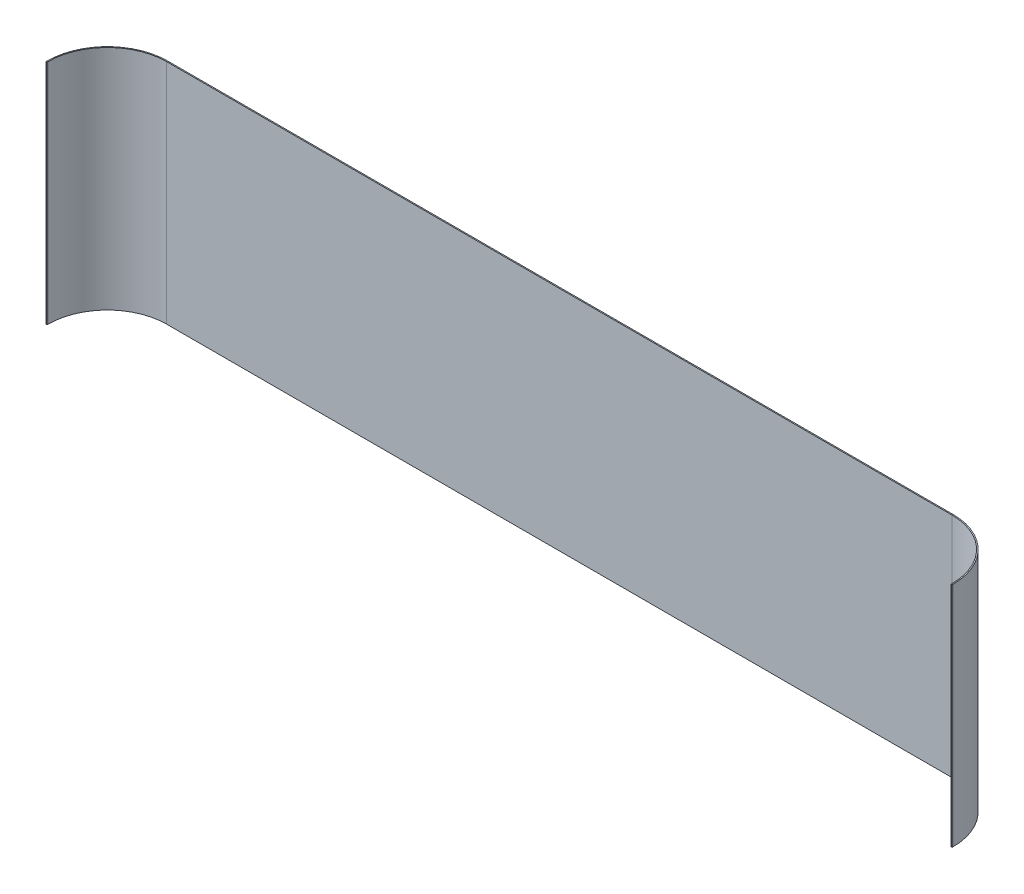
ISO-10303-21;
HEADER;
FILE_DESCRIPTION(('STEP AP214'),'2;1');
FILE_NAME('part.step','',(''),(''),'','','');
FILE_SCHEMA(('AUTOMOTIVE_DESIGN { 1 0 10303 214 1 1 1 1 }'));
ENDSEC;
DATA;
#1=APPLICATION_CONTEXT('core data for automotive mechanical design processes');
#2=APPLICATION_PROTOCOL_DEFINITION('international standard','automotive_design',2000,#1);
#3=PRODUCT_CONTEXT('',#1,'mechanical');
#4=PRODUCT('Part','Part','',(#3));
#5=PRODUCT_RELATED_PRODUCT_CATEGORY('part','',(#4));
#6=PRODUCT_DEFINITION_FORMATION('','',#4);
#7=PRODUCT_DEFINITION_CONTEXT('part definition',#1,'design');
#8=PRODUCT_DEFINITION('design','',#6,#7);
#9=PRODUCT_DEFINITION_SHAPE('','',#8);
#10=(LENGTH_UNIT() NAMED_UNIT(*) SI_UNIT(.MILLI.,.METRE.));
#11=(NAMED_UNIT(*) PLANE_ANGLE_UNIT() SI_UNIT($,.RADIAN.));
#12=(NAMED_UNIT(*) SI_UNIT($,.STERADIAN.) SOLID_ANGLE_UNIT());
#13=UNCERTAINTY_MEASURE_WITH_UNIT(LENGTH_MEASURE(1.E-05),#10,'distance_accuracy_value','');
#14=(GEOMETRIC_REPRESENTATION_CONTEXT(3) GLOBAL_UNCERTAINTY_ASSIGNED_CONTEXT((#13)) GLOBAL_UNIT_ASSIGNED_CONTEXT((#10,
#11,#12)) REPRESENTATION_CONTEXT('',''));
#15=CARTESIAN_POINT('',(0.,0.,0.));
#16=DIRECTION('',(0.,0.,1.));
#17=DIRECTION('',(1.,0.,0.));
#18=AXIS2_PLACEMENT_3D('',#15,#16,#17);
#19=CARTESIAN_POINT('',(-495.,249.,32.0000000000005));
#20=DIRECTION('',(0.,1.,0.));
#21=DIRECTION('',(0.,0.,1.));
#22=AXIS2_PLACEMENT_3D('',#19,#20,#21);
#23=PLANE('',#22);
#24=DIRECTION('',(-1.,0.,0.));
#25=VECTOR('',#24,1.);
#26=CARTESIAN_POINT('',(-495.,249.,32.0000000000005));
#27=LINE('',#26,#25);
#28=CARTESIAN_POINT('',(-495.,249.,32.0000000000005));
#29=VERTEX_POINT('',#28);
#30=CARTESIAN_POINT('',(-496.2,249.,32.0000000000005));
#31=VERTEX_POINT('',#30);
#32=EDGE_CURVE('E11',#29,#31,#27,.T.);
#33=ORIENTED_EDGE('',*,*,#32,.F.);
#34=CARTESIAN_POINT('',(-430.,249.,32.));
#35=DIRECTION('',(0.,1.,0.));
#36=DIRECTION('',(0.,0.,-1.));
#37=AXIS2_PLACEMENT_3D('',#34,#35,#36);
#38=CIRCLE('',#37,65.);
#39=CARTESIAN_POINT('',(-430.,249.,-33.));
#40=VERTEX_POINT('',#39);
#41=EDGE_CURVE('E240',#40,#29,#38,.T.);
#42=ORIENTED_EDGE('',*,*,#41,.F.);
#43=DIRECTION('',(0.,0.,1.));
#44=VECTOR('',#43,1.);
#45=CARTESIAN_POINT('',(-430.,249.,-34.2));
#46=LINE('',#45,#44);
#47=CARTESIAN_POINT('',(-430.,249.,-34.2));
#48=VERTEX_POINT('',#47);
#49=EDGE_CURVE('E43',#48,#40,#46,.T.);
#50=ORIENTED_EDGE('',*,*,#49,.F.);
#51=CARTESIAN_POINT('',(-430.,249.,32.));
#52=DIRECTION('',(0.,1.,0.));
#53=DIRECTION('',(1.,0.,0.));
#54=AXIS2_PLACEMENT_3D('',#51,#52,#53);
#55=CIRCLE('',#54,66.2);
#56=EDGE_CURVE('E167',#48,#31,#55,.T.);
#57=ORIENTED_EDGE('',*,*,#56,.T.);
#58=EDGE_LOOP('',(#33,#42,#50,#57));
#59=FACE_BOUND('',#58,.T.);
#60=ADVANCED_FACE('F35',(#59),#23,.T.);
#61=CARTESIAN_POINT('',(-430.,249.,-34.2));
#62=DIRECTION('',(0.,1.,0.));
#63=DIRECTION('',(0.,0.,1.));
#64=AXIS2_PLACEMENT_3D('',#61,#62,#63);
#65=PLANE('',#64);
#66=DIRECTION('',(0.,0.,1.));
#67=VECTOR('',#66,1.);
#68=CARTESIAN_POINT('',(-495.,249.,33.));
#69=LINE('',#68,#67);
#70=CARTESIAN_POINT('',(-495.,249.,33.));
#71=VERTEX_POINT('',#70);
#72=EDGE_CURVE('E244',#29,#71,#69,.T.);
#73=ORIENTED_EDGE('',*,*,#72,.F.);
#74=ORIENTED_EDGE('',*,*,#32,.T.);
#75=DIRECTION('',(0.,0.,-1.));
#76=VECTOR('',#75,1.);
#77=CARTESIAN_POINT('',(-496.2,249.,33.));
#78=LINE('',#77,#76);
#79=CARTESIAN_POINT('',(-496.2,249.,33.));
#80=VERTEX_POINT('',#79);
#81=EDGE_CURVE('E103',#31,#80,#78,.F.);
#82=ORIENTED_EDGE('',*,*,#81,.T.);
#83=DIRECTION('',(-1.,0.,0.));
#84=VECTOR('',#83,1.);
#85=CARTESIAN_POINT('',(-495.,249.,33.));
#86=LINE('',#85,#84);
#87=EDGE_CURVE('E515',#71,#80,#86,.T.);
#88=ORIENTED_EDGE('',*,*,#87,.F.);
#89=EDGE_LOOP('',(#73,#74,#82,#88));
#90=FACE_BOUND('',#89,.T.);
#91=ADVANCED_FACE('F293',(#90),#65,.T.);
#92=CARTESIAN_POINT('',(-430.,0.,-33.));
#93=DIRECTION('',(0.,-1.,0.));
#94=DIRECTION('',(0.,0.,-1.));
#95=AXIS2_PLACEMENT_3D('',#92,#93,#94);
#96=PLANE('',#95);
#97=DIRECTION('',(0.,0.,-1.));
#98=VECTOR('',#97,1.);
#99=CARTESIAN_POINT('',(-430.,0.,-33.));
#100=LINE('',#99,#98);
#101=CARTESIAN_POINT('',(-430.,0.,-33.));
#102=VERTEX_POINT('',#101);
#103=CARTESIAN_POINT('',(-430.,0.,-34.2));
#104=VERTEX_POINT('',#103);
#105=EDGE_CURVE('E90',#102,#104,#100,.T.);
#106=ORIENTED_EDGE('',*,*,#105,.F.);
#107=CARTESIAN_POINT('',(-430.,0.,32.));
#108=DIRECTION('',(0.,1.,0.));
#109=DIRECTION('',(0.,0.,-1.));
#110=AXIS2_PLACEMENT_3D('',#107,#108,#109);
#111=CIRCLE('',#110,65.);
#112=CARTESIAN_POINT('',(-495.,0.,32.0000000000005));
#113=VERTEX_POINT('',#112);
#114=EDGE_CURVE('E182',#102,#113,#111,.T.);
#115=ORIENTED_EDGE('',*,*,#114,.T.);
#116=DIRECTION('',(1.,0.,0.));
#117=VECTOR('',#116,1.);
#118=CARTESIAN_POINT('',(-496.2,0.,32.0000000000005));
#119=LINE('',#118,#117);
#120=CARTESIAN_POINT('',(-496.2,0.,32.0000000000005));
#121=VERTEX_POINT('',#120);
#122=EDGE_CURVE('E97',#121,#113,#119,.T.);
#123=ORIENTED_EDGE('',*,*,#122,.F.);
#124=CARTESIAN_POINT('',(-430.,0.,32.));
#125=DIRECTION('',(0.,1.,0.));
#126=DIRECTION('',(1.,0.,0.));
#127=AXIS2_PLACEMENT_3D('',#124,#125,#126);
#128=CIRCLE('',#127,66.2);
#129=EDGE_CURVE('E201',#104,#121,#128,.T.);
#130=ORIENTED_EDGE('',*,*,#129,.F.);
#131=EDGE_LOOP('',(#106,#115,#123,#130));
#132=FACE_BOUND('',#131,.T.);
#133=ADVANCED_FACE('F297',(#132),#96,.T.);
#134=CARTESIAN_POINT('',(-496.2,0.,32.0000000000005));
#135=DIRECTION('',(0.,-1.,0.));
#136=DIRECTION('',(0.,0.,-1.));
#137=AXIS2_PLACEMENT_3D('',#134,#135,#136);
#138=PLANE('',#137);
#139=DIRECTION('',(-1.,0.,0.));
#140=VECTOR('',#139,1.);
#141=CARTESIAN_POINT('',(-430.,0.,-33.));
#142=LINE('',#141,#140);
#143=CARTESIAN_POINT('',(429.999999999999,0.,-33.));
#144=VERTEX_POINT('',#143);
#145=EDGE_CURVE('E184',#144,#102,#142,.T.);
#146=ORIENTED_EDGE('',*,*,#145,.T.);
#147=ORIENTED_EDGE('',*,*,#105,.T.);
#148=DIRECTION('',(1.,0.,0.));
#149=VECTOR('',#148,1.);
#150=CARTESIAN_POINT('',(-430.,0.,-34.2));
#151=LINE('',#150,#149);
#152=CARTESIAN_POINT('',(429.999999999999,0.,-34.2));
#153=VERTEX_POINT('',#152);
#154=EDGE_CURVE('E199',#153,#104,#151,.F.);
#155=ORIENTED_EDGE('',*,*,#154,.F.);
#156=DIRECTION('',(0.,0.,1.));
#157=VECTOR('',#156,1.);
#158=CARTESIAN_POINT('',(429.999999999999,0.,-34.2));
#159=LINE('',#158,#157);
#160=EDGE_CURVE('E227',#153,#144,#159,.T.);
#161=ORIENTED_EDGE('',*,*,#160,.T.);
#162=EDGE_LOOP('',(#146,#147,#155,#161));
#163=FACE_BOUND('',#162,.T.);
#164=ADVANCED_FACE('F270',(#163),#138,.T.);
#165=CARTESIAN_POINT('',(429.999999999999,249.,-33.));
#166=DIRECTION('',(0.,1.,0.));
#167=DIRECTION('',(0.,0.,1.));
#168=AXIS2_PLACEMENT_3D('',#165,#166,#167);
#169=PLANE('',#168);
#170=DIRECTION('',(0.,0.,-1.));
#171=VECTOR('',#170,1.);
#172=CARTESIAN_POINT('',(429.999999999999,249.,-33.));
#173=LINE('',#172,#171);
#174=CARTESIAN_POINT('',(429.999999999999,249.,-33.));
#175=VERTEX_POINT('',#174);
#176=CARTESIAN_POINT('',(429.999999999999,249.,-34.2));
#177=VERTEX_POINT('',#176);
#178=EDGE_CURVE('E131',#175,#177,#173,.T.);
#179=ORIENTED_EDGE('',*,*,#178,.F.);
#180=CARTESIAN_POINT('',(430.,249.,32.));
#181=DIRECTION('',(0.,1.,0.));
#182=DIRECTION('',(0.,0.,-1.));
#183=AXIS2_PLACEMENT_3D('',#180,#181,#182);
#184=CIRCLE('',#183,65.);
#185=CARTESIAN_POINT('',(495.,249.,32.0000000000005));
#186=VERTEX_POINT('',#185);
#187=EDGE_CURVE('E247',#186,#175,#184,.T.);
#188=ORIENTED_EDGE('',*,*,#187,.F.);
#189=DIRECTION('',(-1.,0.,0.));
#190=VECTOR('',#189,1.);
#191=CARTESIAN_POINT('',(496.2,249.,32.0000000000005));
#192=LINE('',#191,#190);
#193=CARTESIAN_POINT('',(496.2,249.,32.0000000000005));
#194=VERTEX_POINT('',#193);
#195=EDGE_CURVE('E143',#194,#186,#192,.T.);
#196=ORIENTED_EDGE('',*,*,#195,.F.);
#197=CARTESIAN_POINT('',(430.,249.,32.));
#198=DIRECTION('',(0.,1.,0.));
#199=DIRECTION('',(1.,0.,0.));
#200=AXIS2_PLACEMENT_3D('',#197,#198,#199);
#201=CIRCLE('',#200,66.2);
#202=EDGE_CURVE('E146',#194,#177,#201,.T.);
#203=ORIENTED_EDGE('',*,*,#202,.T.);
#204=EDGE_LOOP('',(#179,#188,#196,#203));
#205=FACE_BOUND('',#204,.T.);
#206=ADVANCED_FACE('F148',(#205),#169,.T.);
#207=CARTESIAN_POINT('',(496.2,249.,32.0000000000005));
#208=DIRECTION('',(0.,1.,0.));
#209=DIRECTION('',(0.,0.,1.));
#210=AXIS2_PLACEMENT_3D('',#207,#208,#209);
#211=PLANE('',#210);
#212=DIRECTION('',(-1.,0.,0.));
#213=VECTOR('',#212,1.);
#214=CARTESIAN_POINT('',(-430.,249.,-33.));
#215=LINE('',#214,#213);
#216=EDGE_CURVE('E138',#175,#40,#215,.T.);
#217=ORIENTED_EDGE('',*,*,#216,.F.);
#218=ORIENTED_EDGE('',*,*,#178,.T.);
#219=DIRECTION('',(1.,0.,0.));
#220=VECTOR('',#219,1.);
#221=CARTESIAN_POINT('',(-430.,249.,-34.2));
#222=LINE('',#221,#220);
#223=EDGE_CURVE('E135',#177,#48,#222,.F.);
#224=ORIENTED_EDGE('',*,*,#223,.T.);
#225=ORIENTED_EDGE('',*,*,#49,.T.);
#226=EDGE_LOOP('',(#217,#218,#224,#225));
#227=FACE_BOUND('',#226,.T.);
#228=ADVANCED_FACE('F133',(#227),#211,.T.);
#229=CARTESIAN_POINT('',(495.,0.,32.0000000000005));
#230=DIRECTION('',(0.,-1.,0.));
#231=DIRECTION('',(0.,0.,-1.));
#232=AXIS2_PLACEMENT_3D('',#229,#230,#231);
#233=PLANE('',#232);
#234=DIRECTION('',(1.,0.,0.));
#235=VECTOR('',#234,1.);
#236=CARTESIAN_POINT('',(495.,0.,32.0000000000005));
#237=LINE('',#236,#235);
#238=CARTESIAN_POINT('',(495.,0.,32.0000000000005));
#239=VERTEX_POINT('',#238);
#240=CARTESIAN_POINT('',(496.2,0.,32.0000000000005));
#241=VERTEX_POINT('',#240);
#242=EDGE_CURVE('E229',#239,#241,#237,.T.);
#243=ORIENTED_EDGE('',*,*,#242,.F.);
#244=CARTESIAN_POINT('',(430.,0.,32.));
#245=DIRECTION('',(0.,1.,0.));
#246=DIRECTION('',(0.,0.,-1.));
#247=AXIS2_PLACEMENT_3D('',#244,#245,#246);
#248=CIRCLE('',#247,65.);
#249=EDGE_CURVE('E186',#239,#144,#248,.T.);
#250=ORIENTED_EDGE('',*,*,#249,.T.);
#251=ORIENTED_EDGE('',*,*,#160,.F.);
#252=CARTESIAN_POINT('',(430.,0.,32.));
#253=DIRECTION('',(0.,1.,0.));
#254=DIRECTION('',(1.,0.,0.));
#255=AXIS2_PLACEMENT_3D('',#252,#253,#254);
#256=CIRCLE('',#255,66.2);
#257=EDGE_CURVE('E159',#241,#153,#256,.T.);
#258=ORIENTED_EDGE('',*,*,#257,.F.);
#259=EDGE_LOOP('',(#243,#250,#251,#258));
#260=FACE_BOUND('',#259,.T.);
#261=ADVANCED_FACE('F268',(#260),#233,.T.);
#262=CARTESIAN_POINT('',(429.999999999999,0.,-34.2));
#263=DIRECTION('',(0.,-1.,0.));
#264=DIRECTION('',(0.,0.,-1.));
#265=AXIS2_PLACEMENT_3D('',#262,#263,#264);
#266=PLANE('',#265);
#267=DIRECTION('',(0.,0.,-1.));
#268=VECTOR('',#267,1.);
#269=CARTESIAN_POINT('',(495.,0.,33.));
#270=LINE('',#269,#268);
#271=CARTESIAN_POINT('',(495.,0.,33.));
#272=VERTEX_POINT('',#271);
#273=EDGE_CURVE('E189',#272,#239,#270,.T.);
#274=ORIENTED_EDGE('',*,*,#273,.T.);
#275=ORIENTED_EDGE('',*,*,#242,.T.);
#276=DIRECTION('',(0.,0.,-1.));
#277=VECTOR('',#276,1.);
#278=CARTESIAN_POINT('',(496.2,0.,33.));
#279=LINE('',#278,#277);
#280=CARTESIAN_POINT('',(496.2,0.,33.));
#281=VERTEX_POINT('',#280);
#282=EDGE_CURVE('E195',#281,#241,#279,.T.);
#283=ORIENTED_EDGE('',*,*,#282,.F.);
#284=DIRECTION('',(-1.,0.,0.));
#285=VECTOR('',#284,1.);
#286=CARTESIAN_POINT('',(496.2,0.,33.));
#287=LINE('',#286,#285);
#288=EDGE_CURVE('E192',#281,#272,#287,.T.);
#289=ORIENTED_EDGE('',*,*,#288,.T.);
#290=EDGE_LOOP('',(#274,#275,#283,#289));
#291=FACE_BOUND('',#290,.T.);
#292=ADVANCED_FACE('F280',(#291),#266,.T.);
#293=CARTESIAN_POINT('',(-496.2,249.,33.));
#294=DIRECTION('',(1.,0.,0.));
#295=DIRECTION('',(0.,0.,-1.));
#296=AXIS2_PLACEMENT_3D('',#293,#294,#295);
#297=PLANE('',#296);
#298=DIRECTION('',(0.,0.,-1.));
#299=VECTOR('',#298,1.);
#300=CARTESIAN_POINT('',(-496.2,0.,33.));
#301=LINE('',#300,#299);
#302=CARTESIAN_POINT('',(-496.2,0.,33.));
#303=VERTEX_POINT('',#302);
#304=EDGE_CURVE('E173',#121,#303,#301,.F.);
#305=ORIENTED_EDGE('',*,*,#304,.T.);
#306=DIRECTION('',(0.,-1.,0.));
#307=VECTOR('',#306,1.);
#308=CARTESIAN_POINT('',(-496.2,249.,33.));
#309=LINE('',#308,#307);
#310=EDGE_CURVE('E225',#80,#303,#309,.T.);
#311=ORIENTED_EDGE('',*,*,#310,.F.);
#312=ORIENTED_EDGE('',*,*,#81,.F.);
#313=DIRECTION('',(0.,-1.,0.));
#314=VECTOR('',#313,1.);
#315=CARTESIAN_POINT('',(-496.2,249.,32.0000000000005));
#316=LINE('',#315,#314);
#317=EDGE_CURVE('E169',#31,#121,#316,.T.);
#318=ORIENTED_EDGE('',*,*,#317,.T.);
#319=EDGE_LOOP('',(#305,#311,#312,#318));
#320=FACE_BOUND('',#319,.T.);
#321=ADVANCED_FACE('F282',(#320),#297,.F.);
#322=CARTESIAN_POINT('',(-495.,249.,33.));
#323=DIRECTION('',(0.,0.,1.));
#324=DIRECTION('',(1.,0.,0.));
#325=AXIS2_PLACEMENT_3D('',#322,#323,#324);
#326=PLANE('',#325);
#327=DIRECTION('',(-1.,0.,0.));
#328=VECTOR('',#327,1.);
#329=CARTESIAN_POINT('',(-495.,0.,33.));
#330=LINE('',#329,#328);
#331=CARTESIAN_POINT('',(-495.,0.,33.));
#332=VERTEX_POINT('',#331);
#333=EDGE_CURVE('E176',#332,#303,#330,.T.);
#334=ORIENTED_EDGE('',*,*,#333,.F.);
#335=DIRECTION('',(0.,-1.,0.));
#336=VECTOR('',#335,1.);
#337=CARTESIAN_POINT('',(-495.,249.,33.));
#338=LINE('',#337,#336);
#339=EDGE_CURVE('E223',#71,#332,#338,.T.);
#340=ORIENTED_EDGE('',*,*,#339,.F.);
#341=ORIENTED_EDGE('',*,*,#87,.T.);
#342=ORIENTED_EDGE('',*,*,#310,.T.);
#343=EDGE_LOOP('',(#334,#340,#341,#342));
#344=FACE_BOUND('',#343,.T.);
#345=ADVANCED_FACE('F288',(#344),#326,.T.);
#346=CARTESIAN_POINT('',(-495.,249.,33.));
#347=DIRECTION('',(1.,0.,0.));
#348=DIRECTION('',(0.,0.,-1.));
#349=AXIS2_PLACEMENT_3D('',#346,#347,#348);
#350=PLANE('',#349);
#351=DIRECTION('',(0.,0.,1.));
#352=VECTOR('',#351,1.);
#353=CARTESIAN_POINT('',(-495.,0.,33.));
#354=LINE('',#353,#352);
#355=EDGE_CURVE('E179',#113,#332,#354,.T.);
#356=ORIENTED_EDGE('',*,*,#355,.F.);
#357=DIRECTION('',(0.,-1.,0.));
#358=VECTOR('',#357,1.);
#359=CARTESIAN_POINT('',(-495.,249.,32.0000000000005));
#360=LINE('',#359,#358);
#361=EDGE_CURVE('E220',#29,#113,#360,.T.);
#362=ORIENTED_EDGE('',*,*,#361,.F.);
#363=ORIENTED_EDGE('',*,*,#72,.T.);
#364=ORIENTED_EDGE('',*,*,#339,.T.);
#365=EDGE_LOOP('',(#356,#362,#363,#364));
#366=FACE_BOUND('',#365,.T.);
#367=ADVANCED_FACE('F338',(#366),#350,.T.);
#368=CARTESIAN_POINT('',(-430.,249.,32.));
#369=DIRECTION('',(0.,-1.,0.));
#370=DIRECTION('',(0.,0.,-1.));
#371=AXIS2_PLACEMENT_3D('',#368,#369,#370);
#372=CYLINDRICAL_SURFACE('',#371,65.);
#373=ORIENTED_EDGE('',*,*,#114,.F.);
#374=DIRECTION('',(0.,-1.,0.));
#375=VECTOR('',#374,1.);
#376=CARTESIAN_POINT('',(-430.,249.,-33.));
#377=LINE('',#376,#375);
#378=EDGE_CURVE('E217',#40,#102,#377,.T.);
#379=ORIENTED_EDGE('',*,*,#378,.F.);
#380=ORIENTED_EDGE('',*,*,#41,.T.);
#381=ORIENTED_EDGE('',*,*,#361,.T.);
#382=EDGE_LOOP('',(#373,#379,#380,#381));
#383=FACE_BOUND('',#382,.T.);
#384=ADVANCED_FACE('F239',(#383),#372,.F.);
#385=CARTESIAN_POINT('',(-430.,249.,-33.));
#386=DIRECTION('',(0.,0.,1.));
#387=DIRECTION('',(1.,0.,0.));
#388=AXIS2_PLACEMENT_3D('',#385,#386,#387);
#389=PLANE('',#388);
#390=ORIENTED_EDGE('',*,*,#145,.F.);
#391=DIRECTION('',(0.,-1.,0.));
#392=VECTOR('',#391,1.);
#393=CARTESIAN_POINT('',(429.999999999999,249.,-33.));
#394=LINE('',#393,#392);
#395=EDGE_CURVE('E214',#175,#144,#394,.T.);
#396=ORIENTED_EDGE('',*,*,#395,.F.);
#397=ORIENTED_EDGE('',*,*,#216,.T.);
#398=ORIENTED_EDGE('',*,*,#378,.T.);
#399=EDGE_LOOP('',(#390,#396,#397,#398));
#400=FACE_BOUND('',#399,.T.);
#401=ADVANCED_FACE('F246',(#400),#389,.T.);
#402=CARTESIAN_POINT('',(430.,249.,32.));
#403=DIRECTION('',(0.,-1.,0.));
#404=DIRECTION('',(0.,0.,-1.));
#405=AXIS2_PLACEMENT_3D('',#402,#403,#404);
#406=CYLINDRICAL_SURFACE('',#405,65.);
#407=ORIENTED_EDGE('',*,*,#249,.F.);
#408=DIRECTION('',(0.,-1.,0.));
#409=VECTOR('',#408,1.);
#410=CARTESIAN_POINT('',(495.,249.,32.0000000000005));
#411=LINE('',#410,#409);
#412=EDGE_CURVE('E211',#186,#239,#411,.T.);
#413=ORIENTED_EDGE('',*,*,#412,.F.);
#414=ORIENTED_EDGE('',*,*,#187,.T.);
#415=ORIENTED_EDGE('',*,*,#395,.T.);
#416=EDGE_LOOP('',(#407,#413,#414,#415));
#417=FACE_BOUND('',#416,.T.);
#418=ADVANCED_FACE('F272',(#417),#406,.F.);
#419=CARTESIAN_POINT('',(495.,249.,33.));
#420=DIRECTION('',(-1.,0.,0.));
#421=DIRECTION('',(0.,0.,1.));
#422=AXIS2_PLACEMENT_3D('',#419,#420,#421);
#423=PLANE('',#422);
#424=ORIENTED_EDGE('',*,*,#273,.F.);
#425=DIRECTION('',(0.,-1.,0.));
#426=VECTOR('',#425,1.);
#427=CARTESIAN_POINT('',(495.,249.,33.));
#428=LINE('',#427,#426);
#429=CARTESIAN_POINT('',(495.,249.,33.));
#430=VERTEX_POINT('',#429);
#431=EDGE_CURVE('E209',#430,#272,#428,.T.);
#432=ORIENTED_EDGE('',*,*,#431,.F.);
#433=DIRECTION('',(0.,0.,-1.));
#434=VECTOR('',#433,1.);
#435=CARTESIAN_POINT('',(495.,249.,33.));
#436=LINE('',#435,#434);
#437=EDGE_CURVE('E249',#430,#186,#436,.T.);
#438=ORIENTED_EDGE('',*,*,#437,.T.);
#439=ORIENTED_EDGE('',*,*,#412,.T.);
#440=EDGE_LOOP('',(#424,#432,#438,#439));
#441=FACE_BOUND('',#440,.T.);
#442=ADVANCED_FACE('F275',(#441),#423,.T.);
#443=CARTESIAN_POINT('',(496.2,249.,33.));
#444=DIRECTION('',(0.,0.,1.));
#445=DIRECTION('',(1.,0.,0.));
#446=AXIS2_PLACEMENT_3D('',#443,#444,#445);
#447=PLANE('',#446);
#448=ORIENTED_EDGE('',*,*,#288,.F.);
#449=DIRECTION('',(0.,-1.,0.));
#450=VECTOR('',#449,1.);
#451=CARTESIAN_POINT('',(496.2,249.,33.));
#452=LINE('',#451,#450);
#453=CARTESIAN_POINT('',(496.2,249.,33.));
#454=VERTEX_POINT('',#453);
#455=EDGE_CURVE('E207',#454,#281,#452,.T.);
#456=ORIENTED_EDGE('',*,*,#455,.F.);
#457=DIRECTION('',(-1.,0.,0.));
#458=VECTOR('',#457,1.);
#459=CARTESIAN_POINT('',(496.2,249.,33.));
#460=LINE('',#459,#458);
#461=EDGE_CURVE('E255',#454,#430,#460,.T.);
#462=ORIENTED_EDGE('',*,*,#461,.T.);
#463=ORIENTED_EDGE('',*,*,#431,.T.);
#464=EDGE_LOOP('',(#448,#456,#462,#463));
#465=FACE_BOUND('',#464,.T.);
#466=ADVANCED_FACE('F278',(#465),#447,.T.);
#467=CARTESIAN_POINT('',(496.2,249.,33.));
#468=DIRECTION('',(-1.,0.,0.));
#469=DIRECTION('',(0.,0.,1.));
#470=AXIS2_PLACEMENT_3D('',#467,#468,#469);
#471=PLANE('',#470);
#472=ORIENTED_EDGE('',*,*,#282,.T.);
#473=DIRECTION('',(0.,-1.,0.));
#474=VECTOR('',#473,1.);
#475=CARTESIAN_POINT('',(496.2,249.,32.0000000000005));
#476=LINE('',#475,#474);
#477=EDGE_CURVE('E161',#194,#241,#476,.T.);
#478=ORIENTED_EDGE('',*,*,#477,.F.);
#479=DIRECTION('',(0.,0.,-1.));
#480=VECTOR('',#479,1.);
#481=CARTESIAN_POINT('',(496.2,249.,33.));
#482=LINE('',#481,#480);
#483=EDGE_CURVE('E152',#454,#194,#482,.T.);
#484=ORIENTED_EDGE('',*,*,#483,.F.);
#485=ORIENTED_EDGE('',*,*,#455,.T.);
#486=EDGE_LOOP('',(#472,#478,#484,#485));
#487=FACE_BOUND('',#486,.T.);
#488=ADVANCED_FACE('F265',(#487),#471,.F.);
#489=CARTESIAN_POINT('',(430.,249.,32.));
#490=DIRECTION('',(0.,-1.,0.));
#491=DIRECTION('',(0.,0.,-1.));
#492=AXIS2_PLACEMENT_3D('',#489,#490,#491);
#493=CYLINDRICAL_SURFACE('',#492,66.2);
#494=ORIENTED_EDGE('',*,*,#257,.T.);
#495=DIRECTION('',(0.,-1.,0.));
#496=VECTOR('',#495,1.);
#497=CARTESIAN_POINT('',(429.999999999999,249.,-34.2));
#498=LINE('',#497,#496);
#499=EDGE_CURVE('E156',#177,#153,#498,.T.);
#500=ORIENTED_EDGE('',*,*,#499,.F.);
#501=ORIENTED_EDGE('',*,*,#202,.F.);
#502=ORIENTED_EDGE('',*,*,#477,.T.);
#503=EDGE_LOOP('',(#494,#500,#501,#502));
#504=FACE_BOUND('',#503,.T.);
#505=ADVANCED_FACE('F157',(#504),#493,.T.);
#506=CARTESIAN_POINT('',(-430.,249.,-34.2));
#507=DIRECTION('',(0.,0.,1.));
#508=DIRECTION('',(1.,0.,0.));
#509=AXIS2_PLACEMENT_3D('',#506,#507,#508);
#510=PLANE('',#509);
#511=ORIENTED_EDGE('',*,*,#154,.T.);
#512=DIRECTION('',(0.,-1.,0.));
#513=VECTOR('',#512,1.);
#514=CARTESIAN_POINT('',(-430.,249.,-34.2));
#515=LINE('',#514,#513);
#516=EDGE_CURVE('E162',#48,#104,#515,.T.);
#517=ORIENTED_EDGE('',*,*,#516,.F.);
#518=ORIENTED_EDGE('',*,*,#223,.F.);
#519=ORIENTED_EDGE('',*,*,#499,.T.);
#520=EDGE_LOOP('',(#511,#517,#518,#519));
#521=FACE_BOUND('',#520,.T.);
#522=ADVANCED_FACE('F164',(#521),#510,.F.);
#523=CARTESIAN_POINT('',(-430.,249.,32.));
#524=DIRECTION('',(0.,-1.,0.));
#525=DIRECTION('',(0.,0.,-1.));
#526=AXIS2_PLACEMENT_3D('',#523,#524,#525);
#527=CYLINDRICAL_SURFACE('',#526,66.2);
#528=ORIENTED_EDGE('',*,*,#129,.T.);
#529=ORIENTED_EDGE('',*,*,#317,.F.);
#530=ORIENTED_EDGE('',*,*,#56,.F.);
#531=ORIENTED_EDGE('',*,*,#516,.T.);
#532=EDGE_LOOP('',(#528,#529,#530,#531));
#533=FACE_BOUND('',#532,.T.);
#534=ADVANCED_FACE('F422',(#533),#527,.T.);
#535=CARTESIAN_POINT('',(-430.,249.,32.));
#536=DIRECTION('',(0.,1.,0.));
#537=DIRECTION('',(1.,0.,0.));
#538=AXIS2_PLACEMENT_3D('',#535,#536,#537);
#539=PLANE('',#538);
#540=ORIENTED_EDGE('',*,*,#483,.T.);
#541=ORIENTED_EDGE('',*,*,#195,.T.);
#542=ORIENTED_EDGE('',*,*,#437,.F.);
#543=ORIENTED_EDGE('',*,*,#461,.F.);
#544=EDGE_LOOP('',(#540,#541,#542,#543));
#545=FACE_BOUND('',#544,.T.);
#546=ADVANCED_FACE('F261',(#545),#539,.T.);
#547=CARTESIAN_POINT('',(-430.,0.,32.));
#548=DIRECTION('',(0.,1.,0.));
#549=DIRECTION('',(1.,0.,0.));
#550=AXIS2_PLACEMENT_3D('',#547,#548,#549);
#551=PLANE('',#550);
#552=ORIENTED_EDGE('',*,*,#304,.F.);
#553=ORIENTED_EDGE('',*,*,#122,.T.);
#554=ORIENTED_EDGE('',*,*,#355,.T.);
#555=ORIENTED_EDGE('',*,*,#333,.T.);
#556=EDGE_LOOP('',(#552,#553,#554,#555));
#557=FACE_BOUND('',#556,.T.);
#558=ADVANCED_FACE('F442',(#557),#551,.F.);
#559=CLOSED_SHELL('',(#60,#91,#133,#164,#206,#228,#261,#292,#321,#345,#367,#384,#401,#418,#442,
#466,#488,#505,#522,#534,#546,#558));
#560=MANIFOLD_SOLID_BREP('B2',#559);
#561=ADVANCED_BREP_SHAPE_REPRESENTATION('',(#18,#560),#14);
#562=SHAPE_DEFINITION_REPRESENTATION(#9,#561);
ENDSEC;
END-ISO-10303-21;
